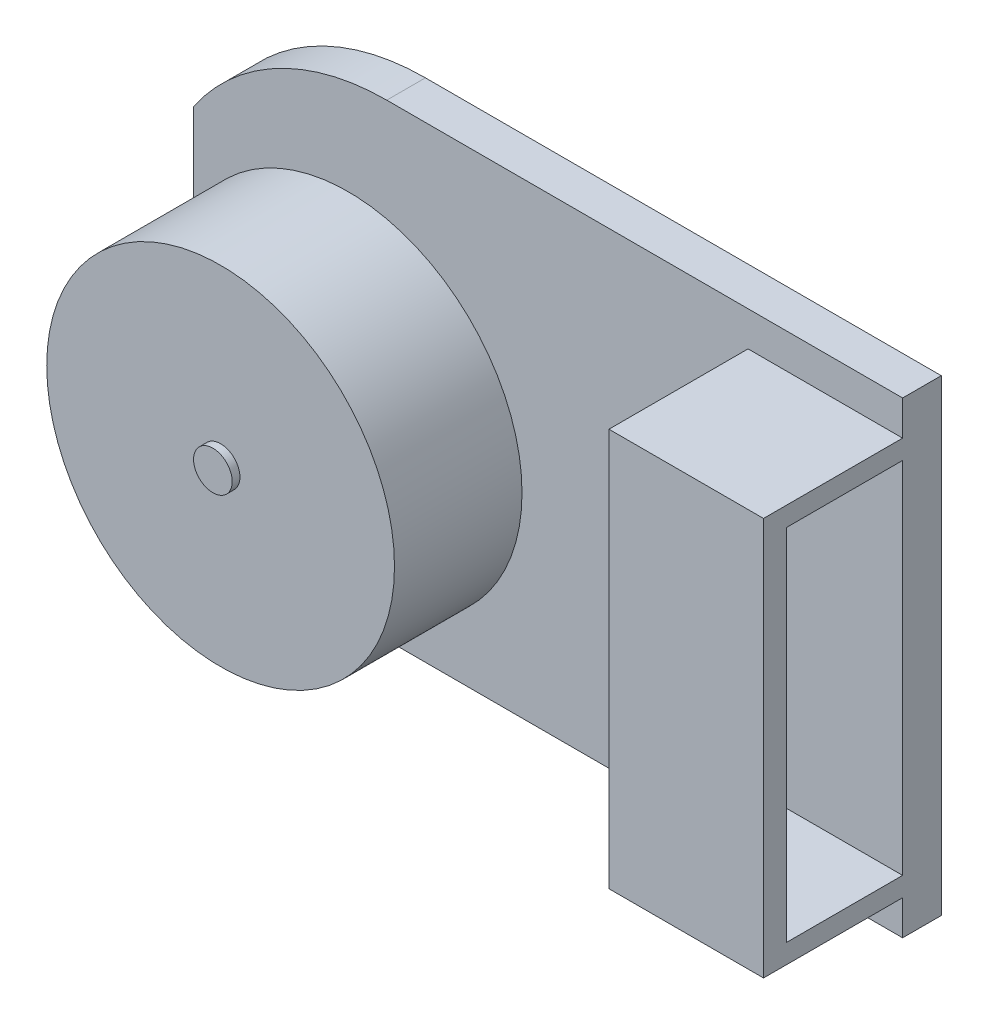
ISO-10303-21;
HEADER;
FILE_DESCRIPTION(('STEP AP214'),'2;1');
FILE_NAME('part.step','',(''),(''),'','','');
FILE_SCHEMA(('AUTOMOTIVE_DESIGN { 1 0 10303 214 1 1 1 1 }'));
ENDSEC;
DATA;
#1=APPLICATION_CONTEXT('core data for automotive mechanical design processes');
#2=APPLICATION_PROTOCOL_DEFINITION('international standard','automotive_design',2000,#1);
#3=PRODUCT_CONTEXT('',#1,'mechanical');
#4=PRODUCT('Part','Part','',(#3));
#5=PRODUCT_RELATED_PRODUCT_CATEGORY('part','',(#4));
#6=PRODUCT_DEFINITION_FORMATION('','',#4);
#7=PRODUCT_DEFINITION_CONTEXT('part definition',#1,'design');
#8=PRODUCT_DEFINITION('design','',#6,#7);
#9=PRODUCT_DEFINITION_SHAPE('','',#8);
#10=(LENGTH_UNIT() NAMED_UNIT(*) SI_UNIT(.MILLI.,.METRE.));
#11=(NAMED_UNIT(*) PLANE_ANGLE_UNIT() SI_UNIT($,.RADIAN.));
#12=(NAMED_UNIT(*) SI_UNIT($,.STERADIAN.) SOLID_ANGLE_UNIT());
#13=UNCERTAINTY_MEASURE_WITH_UNIT(LENGTH_MEASURE(1.E-05),#10,'distance_accuracy_value','');
#14=(GEOMETRIC_REPRESENTATION_CONTEXT(3) GLOBAL_UNCERTAINTY_ASSIGNED_CONTEXT((#13)) GLOBAL_UNIT_ASSIGNED_CONTEXT((#10,
#11,#12)) REPRESENTATION_CONTEXT('',''));
#15=CARTESIAN_POINT('',(0.,0.,0.));
#16=DIRECTION('',(0.,0.,1.));
#17=DIRECTION('',(1.,0.,0.));
#18=AXIS2_PLACEMENT_3D('',#15,#16,#17);
#19=CARTESIAN_POINT('',(0.,0.,1.));
#20=DIRECTION('',(0.,0.,1.));
#21=DIRECTION('',(1.,0.,0.));
#22=AXIS2_PLACEMENT_3D('',#19,#20,#21);
#23=PLANE('',#22);
#24=CARTESIAN_POINT('',(0.,0.,1.));
#25=DIRECTION('',(0.,0.,1.));
#26=DIRECTION('',(1.,0.,0.));
#27=AXIS2_PLACEMENT_3D('',#24,#25,#26);
#28=CIRCLE('',#27,0.5);
#29=CARTESIAN_POINT('',(0.5,0.,1.));
#30=VERTEX_POINT('',#29);
#31=EDGE_CURVE('E234',#30,#30,#28,.T.);
#32=ORIENTED_EDGE('',*,*,#31,.F.);
#33=EDGE_LOOP('',(#32));
#34=FACE_BOUND('',#33,.T.);
#35=DIRECTION('',(0.,-1.,0.));
#36=VECTOR('',#35,1.);
#37=CARTESIAN_POINT('',(9.35,5.15,1.));
#38=LINE('',#37,#36);
#39=CARTESIAN_POINT('',(9.35,5.15,1.));
#40=VERTEX_POINT('',#39);
#41=CARTESIAN_POINT('',(9.35000000000001,-5.15,1.));
#42=VERTEX_POINT('',#41);
#43=EDGE_CURVE('E195',#40,#42,#38,.T.);
#44=ORIENTED_EDGE('',*,*,#43,.F.);
#45=DIRECTION('',(-1.,0.,0.));
#46=VECTOR('',#45,1.);
#47=CARTESIAN_POINT('',(13.35,5.15,1.));
#48=LINE('',#47,#46);
#49=CARTESIAN_POINT('',(13.35,5.15,1.));
#50=VERTEX_POINT('',#49);
#51=EDGE_CURVE('E153',#50,#40,#48,.T.);
#52=ORIENTED_EDGE('',*,*,#51,.F.);
#53=DIRECTION('',(0.,-1.,0.));
#54=VECTOR('',#53,1.);
#55=CARTESIAN_POINT('',(13.35,0.,1.));
#56=LINE('',#55,#54);
#57=CARTESIAN_POINT('',(13.35,6.05,1.));
#58=VERTEX_POINT('',#57);
#59=EDGE_CURVE('E231',#58,#50,#56,.T.);
#60=ORIENTED_EDGE('',*,*,#59,.F.);
#61=DIRECTION('',(1.,0.,0.));
#62=VECTOR('',#61,1.);
#63=CARTESIAN_POINT('',(0.,6.05,1.));
#64=LINE('',#63,#62);
#65=CARTESIAN_POINT('',(0.,6.05,1.));
#66=VERTEX_POINT('',#65);
#67=EDGE_CURVE('E216',#66,#58,#64,.T.);
#68=ORIENTED_EDGE('',*,*,#67,.F.);
#69=CARTESIAN_POINT('',(0.,0.,1.));
#70=DIRECTION('',(0.,0.,1.));
#71=DIRECTION('',(1.,0.,0.));
#72=AXIS2_PLACEMENT_3D('',#69,#70,#71);
#73=CIRCLE('',#72,6.05);
#74=CARTESIAN_POINT('',(-5.,3.40624426605022,1.));
#75=VERTEX_POINT('',#74);
#76=EDGE_CURVE('E219',#66,#75,#73,.T.);
#77=ORIENTED_EDGE('',*,*,#76,.T.);
#78=DIRECTION('',(0.,1.,0.));
#79=VECTOR('',#78,1.);
#80=CARTESIAN_POINT('',(-5.,0.,1.));
#81=LINE('',#80,#79);
#82=CARTESIAN_POINT('',(-5.,-3.40624426605022,1.));
#83=VERTEX_POINT('',#82);
#84=EDGE_CURVE('E222',#83,#75,#81,.T.);
#85=ORIENTED_EDGE('',*,*,#84,.F.);
#86=CARTESIAN_POINT('',(0.,0.,1.));
#87=DIRECTION('',(0.,0.,1.));
#88=DIRECTION('',(1.,0.,0.));
#89=AXIS2_PLACEMENT_3D('',#86,#87,#88);
#90=CIRCLE('',#89,6.05);
#91=CARTESIAN_POINT('',(0.,-6.05,1.));
#92=VERTEX_POINT('',#91);
#93=EDGE_CURVE('E225',#83,#92,#90,.T.);
#94=ORIENTED_EDGE('',*,*,#93,.T.);
#95=DIRECTION('',(1.,0.,0.));
#96=VECTOR('',#95,1.);
#97=CARTESIAN_POINT('',(0.,-6.05,1.));
#98=LINE('',#97,#96);
#99=CARTESIAN_POINT('',(13.35,-6.05,1.));
#100=VERTEX_POINT('',#99);
#101=EDGE_CURVE('E227',#92,#100,#98,.T.);
#102=ORIENTED_EDGE('',*,*,#101,.T.);
#103=CARTESIAN_POINT('',(13.35,-5.15,1.));
#104=VERTEX_POINT('',#103);
#105=EDGE_CURVE('E230',#104,#100,#56,.T.);
#106=ORIENTED_EDGE('',*,*,#105,.F.);
#107=DIRECTION('',(1.,0.,0.));
#108=VECTOR('',#107,1.);
#109=CARTESIAN_POINT('',(13.35,-5.15,1.));
#110=LINE('',#109,#108);
#111=EDGE_CURVE('E187',#42,#104,#110,.T.);
#112=ORIENTED_EDGE('',*,*,#111,.F.);
#113=EDGE_LOOP('',(#44,#52,#60,#68,#77,#85,#94,#102,#106,#112));
#114=FACE_BOUND('',#113,.T.);
#115=ADVANCED_FACE('F40',(#34,#114),#23,.T.);
#116=CARTESIAN_POINT('',(0.,0.,5.5));
#117=DIRECTION('',(0.,0.,-1.));
#118=DIRECTION('',(-1.,0.,0.));
#119=AXIS2_PLACEMENT_3D('',#116,#117,#118);
#120=CYLINDRICAL_SURFACE('',#119,0.5);
#121=ORIENTED_EDGE('',*,*,#31,.T.);
#122=EDGE_LOOP('',(#121));
#123=FACE_BOUND('',#122,.T.);
#124=CARTESIAN_POINT('',(0.,0.,2.));
#125=DIRECTION('',(0.,0.,1.));
#126=DIRECTION('',(1.,0.,0.));
#127=AXIS2_PLACEMENT_3D('',#124,#125,#126);
#128=CIRCLE('',#127,0.5);
#129=CARTESIAN_POINT('',(0.5,0.,2.));
#130=VERTEX_POINT('',#129);
#131=EDGE_CURVE('E44',#130,#130,#128,.F.);
#132=ORIENTED_EDGE('',*,*,#131,.T.);
#133=EDGE_LOOP('',(#132));
#134=FACE_BOUND('',#133,.T.);
#135=ADVANCED_FACE('F318',(#123,#134),#120,.T.);
#136=CARTESIAN_POINT('',(0.,6.05,1.));
#137=DIRECTION('',(0.,1.,0.));
#138=DIRECTION('',(0.,0.,1.));
#139=AXIS2_PLACEMENT_3D('',#136,#137,#138);
#140=PLANE('',#139);
#141=DIRECTION('',(1.,0.,0.));
#142=VECTOR('',#141,1.);
#143=CARTESIAN_POINT('',(0.,6.05,0.));
#144=LINE('',#143,#142);
#145=CARTESIAN_POINT('',(0.,6.05,0.));
#146=VERTEX_POINT('',#145);
#147=CARTESIAN_POINT('',(13.35,6.05,0.));
#148=VERTEX_POINT('',#147);
#149=EDGE_CURVE('E215',#146,#148,#144,.T.);
#150=ORIENTED_EDGE('',*,*,#149,.F.);
#151=DIRECTION('',(0.,0.,-1.));
#152=VECTOR('',#151,1.);
#153=CARTESIAN_POINT('',(0.,6.05,1.));
#154=LINE('',#153,#152);
#155=EDGE_CURVE('E49',#66,#146,#154,.T.);
#156=ORIENTED_EDGE('',*,*,#155,.F.);
#157=ORIENTED_EDGE('',*,*,#67,.T.);
#158=DIRECTION('',(0.,0.,-1.));
#159=VECTOR('',#158,1.);
#160=CARTESIAN_POINT('',(13.35,6.05,1.));
#161=LINE('',#160,#159);
#162=EDGE_CURVE('E237',#58,#148,#161,.T.);
#163=ORIENTED_EDGE('',*,*,#162,.T.);
#164=EDGE_LOOP('',(#150,#156,#157,#163));
#165=FACE_BOUND('',#164,.T.);
#166=ADVANCED_FACE('F42',(#165),#140,.T.);
#167=CARTESIAN_POINT('',(0.,0.,1.));
#168=DIRECTION('',(0.,0.,-1.));
#169=DIRECTION('',(-1.,0.,0.));
#170=AXIS2_PLACEMENT_3D('',#167,#168,#169);
#171=CYLINDRICAL_SURFACE('',#170,6.05);
#172=CARTESIAN_POINT('',(0.,0.,0.));
#173=DIRECTION('',(0.,0.,1.));
#174=DIRECTION('',(1.,0.,0.));
#175=AXIS2_PLACEMENT_3D('',#172,#173,#174);
#176=CIRCLE('',#175,6.05);
#177=CARTESIAN_POINT('',(-5.,3.40624426605022,0.));
#178=VERTEX_POINT('',#177);
#179=EDGE_CURVE('E240',#146,#178,#176,.T.);
#180=ORIENTED_EDGE('',*,*,#179,.T.);
#181=DIRECTION('',(0.,0.,-1.));
#182=VECTOR('',#181,1.);
#183=CARTESIAN_POINT('',(-5.,3.40624426605022,1.));
#184=LINE('',#183,#182);
#185=EDGE_CURVE('E261',#75,#178,#184,.T.);
#186=ORIENTED_EDGE('',*,*,#185,.F.);
#187=ORIENTED_EDGE('',*,*,#76,.F.);
#188=ORIENTED_EDGE('',*,*,#155,.T.);
#189=EDGE_LOOP('',(#180,#186,#187,#188));
#190=FACE_BOUND('',#189,.T.);
#191=ADVANCED_FACE('F266',(#190),#171,.T.);
#192=CARTESIAN_POINT('',(-5.,0.,1.));
#193=DIRECTION('',(-1.,0.,0.));
#194=DIRECTION('',(0.,0.,1.));
#195=AXIS2_PLACEMENT_3D('',#192,#193,#194);
#196=PLANE('',#195);
#197=DIRECTION('',(0.,1.,0.));
#198=VECTOR('',#197,1.);
#199=CARTESIAN_POINT('',(-5.,0.,0.));
#200=LINE('',#199,#198);
#201=CARTESIAN_POINT('',(-5.,-3.40624426605022,0.));
#202=VERTEX_POINT('',#201);
#203=EDGE_CURVE('E243',#202,#178,#200,.T.);
#204=ORIENTED_EDGE('',*,*,#203,.F.);
#205=DIRECTION('',(0.,0.,-1.));
#206=VECTOR('',#205,1.);
#207=CARTESIAN_POINT('',(-5.,-3.40624426605022,1.));
#208=LINE('',#207,#206);
#209=EDGE_CURVE('E259',#83,#202,#208,.T.);
#210=ORIENTED_EDGE('',*,*,#209,.F.);
#211=ORIENTED_EDGE('',*,*,#84,.T.);
#212=ORIENTED_EDGE('',*,*,#185,.T.);
#213=EDGE_LOOP('',(#204,#210,#211,#212));
#214=FACE_BOUND('',#213,.T.);
#215=ADVANCED_FACE('F291',(#214),#196,.T.);
#216=CARTESIAN_POINT('',(0.,0.,1.));
#217=DIRECTION('',(0.,0.,-1.));
#218=DIRECTION('',(-1.,0.,0.));
#219=AXIS2_PLACEMENT_3D('',#216,#217,#218);
#220=CYLINDRICAL_SURFACE('',#219,6.05);
#221=CARTESIAN_POINT('',(0.,0.,0.));
#222=DIRECTION('',(0.,0.,1.));
#223=DIRECTION('',(1.,0.,0.));
#224=AXIS2_PLACEMENT_3D('',#221,#222,#223);
#225=CIRCLE('',#224,6.05);
#226=CARTESIAN_POINT('',(0.,-6.05,0.));
#227=VERTEX_POINT('',#226);
#228=EDGE_CURVE('E246',#202,#227,#225,.T.);
#229=ORIENTED_EDGE('',*,*,#228,.T.);
#230=DIRECTION('',(0.,0.,-1.));
#231=VECTOR('',#230,1.);
#232=CARTESIAN_POINT('',(0.,-6.05,1.));
#233=LINE('',#232,#231);
#234=EDGE_CURVE('E256',#92,#227,#233,.T.);
#235=ORIENTED_EDGE('',*,*,#234,.F.);
#236=ORIENTED_EDGE('',*,*,#93,.F.);
#237=ORIENTED_EDGE('',*,*,#209,.T.);
#238=EDGE_LOOP('',(#229,#235,#236,#237));
#239=FACE_BOUND('',#238,.T.);
#240=ADVANCED_FACE('F288',(#239),#220,.T.);
#241=CARTESIAN_POINT('',(0.,-6.05,1.));
#242=DIRECTION('',(0.,1.,0.));
#243=DIRECTION('',(0.,0.,1.));
#244=AXIS2_PLACEMENT_3D('',#241,#242,#243);
#245=PLANE('',#244);
#246=DIRECTION('',(1.,0.,0.));
#247=VECTOR('',#246,1.);
#248=CARTESIAN_POINT('',(0.,-6.05,0.));
#249=LINE('',#248,#247);
#250=CARTESIAN_POINT('',(13.35,-6.05,0.));
#251=VERTEX_POINT('',#250);
#252=EDGE_CURVE('E248',#227,#251,#249,.T.);
#253=ORIENTED_EDGE('',*,*,#252,.T.);
#254=DIRECTION('',(0.,0.,-1.));
#255=VECTOR('',#254,1.);
#256=CARTESIAN_POINT('',(13.35,-6.05,1.));
#257=LINE('',#256,#255);
#258=EDGE_CURVE('E254',#100,#251,#257,.T.);
#259=ORIENTED_EDGE('',*,*,#258,.F.);
#260=ORIENTED_EDGE('',*,*,#101,.F.);
#261=ORIENTED_EDGE('',*,*,#234,.T.);
#262=EDGE_LOOP('',(#253,#259,#260,#261));
#263=FACE_BOUND('',#262,.T.);
#264=ADVANCED_FACE('F283',(#263),#245,.F.);
#265=CARTESIAN_POINT('',(13.35,0.,1.));
#266=DIRECTION('',(1.,0.,0.));
#267=DIRECTION('',(0.,0.,-1.));
#268=AXIS2_PLACEMENT_3D('',#265,#266,#267);
#269=PLANE('',#268);
#270=DIRECTION('',(0.,-1.,0.));
#271=VECTOR('',#270,1.);
#272=CARTESIAN_POINT('',(13.35,0.,4.));
#273=LINE('',#272,#271);
#274=CARTESIAN_POINT('',(13.35,4.65,4.));
#275=VERTEX_POINT('',#274);
#276=CARTESIAN_POINT('',(13.35,-4.65,4.));
#277=VERTEX_POINT('',#276);
#278=EDGE_CURVE('E174',#275,#277,#273,.T.);
#279=ORIENTED_EDGE('',*,*,#278,.F.);
#280=DIRECTION('',(0.,0.,-1.));
#281=VECTOR('',#280,1.);
#282=CARTESIAN_POINT('',(13.35,4.65,4.));
#283=LINE('',#282,#281);
#284=CARTESIAN_POINT('',(13.35,4.65,1.));
#285=VERTEX_POINT('',#284);
#286=EDGE_CURVE('E167',#275,#285,#283,.T.);
#287=ORIENTED_EDGE('',*,*,#286,.T.);
#288=DIRECTION('',(0.,-1.,0.));
#289=VECTOR('',#288,1.);
#290=CARTESIAN_POINT('',(13.35,0.,1.));
#291=LINE('',#290,#289);
#292=CARTESIAN_POINT('',(13.35,-4.65,1.));
#293=VERTEX_POINT('',#292);
#294=EDGE_CURVE('E168',#285,#293,#291,.T.);
#295=ORIENTED_EDGE('',*,*,#294,.T.);
#296=DIRECTION('',(0.,0.,-1.));
#297=VECTOR('',#296,1.);
#298=CARTESIAN_POINT('',(13.35,-4.65,4.));
#299=LINE('',#298,#297);
#300=EDGE_CURVE('E181',#277,#293,#299,.T.);
#301=ORIENTED_EDGE('',*,*,#300,.F.);
#302=EDGE_LOOP('',(#279,#287,#295,#301));
#303=FACE_BOUND('',#302,.T.);
#304=DIRECTION('',(0.,-1.,0.));
#305=VECTOR('',#304,1.);
#306=CARTESIAN_POINT('',(13.35,0.,0.));
#307=LINE('',#306,#305);
#308=EDGE_CURVE('E220',#148,#251,#307,.T.);
#309=ORIENTED_EDGE('',*,*,#308,.F.);
#310=ORIENTED_EDGE('',*,*,#162,.F.);
#311=ORIENTED_EDGE('',*,*,#59,.T.);
#312=DIRECTION('',(0.,0.,-1.));
#313=VECTOR('',#312,1.);
#314=CARTESIAN_POINT('',(13.35,5.15,4.6));
#315=LINE('',#314,#313);
#316=CARTESIAN_POINT('',(13.35,5.15,4.6));
#317=VERTEX_POINT('',#316);
#318=EDGE_CURVE('E204',#317,#50,#315,.T.);
#319=ORIENTED_EDGE('',*,*,#318,.F.);
#320=DIRECTION('',(0.,1.,0.));
#321=VECTOR('',#320,1.);
#322=CARTESIAN_POINT('',(13.35,0.,4.6));
#323=LINE('',#322,#321);
#324=CARTESIAN_POINT('',(13.35,-5.15,4.6));
#325=VERTEX_POINT('',#324);
#326=EDGE_CURVE('E184',#325,#317,#323,.T.);
#327=ORIENTED_EDGE('',*,*,#326,.F.);
#328=DIRECTION('',(0.,0.,-1.));
#329=VECTOR('',#328,1.);
#330=CARTESIAN_POINT('',(13.35,-5.15,4.6));
#331=LINE('',#330,#329);
#332=EDGE_CURVE('E193',#325,#104,#331,.T.);
#333=ORIENTED_EDGE('',*,*,#332,.T.);
#334=ORIENTED_EDGE('',*,*,#105,.T.);
#335=ORIENTED_EDGE('',*,*,#258,.T.);
#336=EDGE_LOOP('',(#309,#310,#311,#319,#327,#333,#334,#335));
#337=FACE_BOUND('',#336,.T.);
#338=ADVANCED_FACE('F278',(#303,#337),#269,.T.);
#339=CARTESIAN_POINT('',(0.,0.,0.));
#340=DIRECTION('',(0.,0.,1.));
#341=DIRECTION('',(1.,0.,0.));
#342=AXIS2_PLACEMENT_3D('',#339,#340,#341);
#343=PLANE('',#342);
#344=ORIENTED_EDGE('',*,*,#149,.T.);
#345=ORIENTED_EDGE('',*,*,#308,.T.);
#346=ORIENTED_EDGE('',*,*,#252,.F.);
#347=ORIENTED_EDGE('',*,*,#228,.F.);
#348=ORIENTED_EDGE('',*,*,#203,.T.);
#349=ORIENTED_EDGE('',*,*,#179,.F.);
#350=EDGE_LOOP('',(#344,#345,#346,#347,#348,#349));
#351=FACE_BOUND('',#350,.T.);
#352=ADVANCED_FACE('F272',(#351),#343,.F.);
#353=CARTESIAN_POINT('',(0.,0.,18.0279220613579));
#354=DIRECTION('',(0.,0.,-1.));
#355=DIRECTION('',(-1.,0.,0.));
#356=AXIS2_PLACEMENT_3D('',#353,#354,#355);
#357=CYLINDRICAL_SURFACE('',#356,4.5);
#358=CARTESIAN_POINT('',(0.,0.,2.));
#359=DIRECTION('',(0.,0.,1.));
#360=DIRECTION('',(1.,0.,0.));
#361=AXIS2_PLACEMENT_3D('',#358,#359,#360);
#362=CIRCLE('',#361,4.5);
#363=CARTESIAN_POINT('',(4.5,0.,2.));
#364=VERTEX_POINT('',#363);
#365=EDGE_CURVE('E206',#364,#364,#362,.T.);
#366=ORIENTED_EDGE('',*,*,#365,.T.);
#367=EDGE_LOOP('',(#366));
#368=FACE_BOUND('',#367,.T.);
#369=CARTESIAN_POINT('',(0.,0.,5.3));
#370=DIRECTION('',(0.,0.,1.));
#371=DIRECTION('',(1.,0.,0.));
#372=AXIS2_PLACEMENT_3D('',#369,#370,#371);
#373=CIRCLE('',#372,4.5);
#374=CARTESIAN_POINT('',(4.5,0.,5.3));
#375=VERTEX_POINT('',#374);
#376=EDGE_CURVE('E209',#375,#375,#373,.T.);
#377=ORIENTED_EDGE('',*,*,#376,.F.);
#378=EDGE_LOOP('',(#377));
#379=FACE_BOUND('',#378,.T.);
#380=ADVANCED_FACE('F332',(#368,#379),#357,.T.);
#381=CARTESIAN_POINT('',(0.,0.,2.));
#382=DIRECTION('',(0.,0.,1.));
#383=DIRECTION('',(1.,0.,0.));
#384=AXIS2_PLACEMENT_3D('',#381,#382,#383);
#385=PLANE('',#384);
#386=ORIENTED_EDGE('',*,*,#131,.F.);
#387=EDGE_LOOP('',(#386));
#388=FACE_BOUND('',#387,.T.);
#389=ORIENTED_EDGE('',*,*,#365,.F.);
#390=EDGE_LOOP('',(#389));
#391=FACE_BOUND('',#390,.T.);
#392=ADVANCED_FACE('F391',(#388,#391),#385,.F.);
#393=CARTESIAN_POINT('',(0.,0.,5.3));
#394=DIRECTION('',(0.,0.,1.));
#395=DIRECTION('',(1.,0.,0.));
#396=AXIS2_PLACEMENT_3D('',#393,#394,#395);
#397=PLANE('',#396);
#398=CARTESIAN_POINT('',(0.,0.,5.3));
#399=DIRECTION('',(0.,0.,1.));
#400=DIRECTION('',(1.,0.,0.));
#401=AXIS2_PLACEMENT_3D('',#398,#399,#400);
#402=CIRCLE('',#401,0.5);
#403=CARTESIAN_POINT('',(0.5,0.,5.3));
#404=VERTEX_POINT('',#403);
#405=EDGE_CURVE('E11',#404,#404,#402,.F.);
#406=ORIENTED_EDGE('',*,*,#405,.T.);
#407=EDGE_LOOP('',(#406));
#408=FACE_BOUND('',#407,.T.);
#409=ORIENTED_EDGE('',*,*,#376,.T.);
#410=EDGE_LOOP('',(#409));
#411=FACE_BOUND('',#410,.T.);
#412=ADVANCED_FACE('F373',(#408,#411),#397,.T.);
#413=CARTESIAN_POINT('',(0.,0.,5.5));
#414=DIRECTION('',(0.,0.,-1.));
#415=DIRECTION('',(-1.,0.,0.));
#416=AXIS2_PLACEMENT_3D('',#413,#414,#415);
#417=PLANE('',#416);
#418=CARTESIAN_POINT('',(0.,0.,5.5));
#419=DIRECTION('',(0.,0.,-1.));
#420=DIRECTION('',(-1.,0.,0.));
#421=AXIS2_PLACEMENT_3D('',#418,#419,#420);
#422=CIRCLE('',#421,0.5);
#423=CARTESIAN_POINT('',(-0.5,0.,5.5));
#424=VERTEX_POINT('',#423);
#425=EDGE_CURVE('E212',#424,#424,#422,.T.);
#426=ORIENTED_EDGE('',*,*,#425,.F.);
#427=EDGE_LOOP('',(#426));
#428=FACE_BOUND('',#427,.T.);
#429=ADVANCED_FACE('F363',(#428),#417,.F.);
#430=ORIENTED_EDGE('',*,*,#405,.F.);
#431=EDGE_LOOP('',(#430));
#432=FACE_BOUND('',#431,.T.);
#433=ORIENTED_EDGE('',*,*,#425,.T.);
#434=EDGE_LOOP('',(#433));
#435=FACE_BOUND('',#434,.T.);
#436=ADVANCED_FACE('F326',(#432,#435),#120,.T.);
#437=CARTESIAN_POINT('',(13.35,5.15,4.6));
#438=DIRECTION('',(0.,-1.,0.));
#439=DIRECTION('',(1.,0.,0.));
#440=AXIS2_PLACEMENT_3D('',#437,#438,#439);
#441=PLANE('',#440);
#442=ORIENTED_EDGE('',*,*,#51,.T.);
#443=DIRECTION('',(0.,0.,-1.));
#444=VECTOR('',#443,1.);
#445=CARTESIAN_POINT('',(9.35,5.15,4.6));
#446=LINE('',#445,#444);
#447=CARTESIAN_POINT('',(9.35,5.15,4.6));
#448=VERTEX_POINT('',#447);
#449=EDGE_CURVE('E201',#448,#40,#446,.T.);
#450=ORIENTED_EDGE('',*,*,#449,.F.);
#451=DIRECTION('',(-1.,0.,0.));
#452=VECTOR('',#451,1.);
#453=CARTESIAN_POINT('',(13.35,5.15,4.6));
#454=LINE('',#453,#452);
#455=EDGE_CURVE('E186',#317,#448,#454,.T.);
#456=ORIENTED_EDGE('',*,*,#455,.F.);
#457=ORIENTED_EDGE('',*,*,#318,.T.);
#458=EDGE_LOOP('',(#442,#450,#456,#457));
#459=FACE_BOUND('',#458,.T.);
#460=ADVANCED_FACE('F298',(#459),#441,.F.);
#461=CARTESIAN_POINT('',(9.35,5.15,4.6));
#462=DIRECTION('',(1.,0.,0.));
#463=DIRECTION('',(0.,1.,0.));
#464=AXIS2_PLACEMENT_3D('',#461,#462,#463);
#465=PLANE('',#464);
#466=ORIENTED_EDGE('',*,*,#43,.T.);
#467=DIRECTION('',(0.,0.,-1.));
#468=VECTOR('',#467,1.);
#469=CARTESIAN_POINT('',(9.35000000000001,-5.15,4.6));
#470=LINE('',#469,#468);
#471=CARTESIAN_POINT('',(9.35000000000001,-5.15,4.6));
#472=VERTEX_POINT('',#471);
#473=EDGE_CURVE('E64',#472,#42,#470,.T.);
#474=ORIENTED_EDGE('',*,*,#473,.F.);
#475=DIRECTION('',(0.,-1.,0.));
#476=VECTOR('',#475,1.);
#477=CARTESIAN_POINT('',(9.35,5.15,4.6));
#478=LINE('',#477,#476);
#479=EDGE_CURVE('E189',#448,#472,#478,.T.);
#480=ORIENTED_EDGE('',*,*,#479,.F.);
#481=ORIENTED_EDGE('',*,*,#449,.T.);
#482=EDGE_LOOP('',(#466,#474,#480,#481));
#483=FACE_BOUND('',#482,.T.);
#484=ADVANCED_FACE('F302',(#483),#465,.F.);
#485=CARTESIAN_POINT('',(13.35,-5.15,4.6));
#486=DIRECTION('',(0.,1.,0.));
#487=DIRECTION('',(-1.,0.,0.));
#488=AXIS2_PLACEMENT_3D('',#485,#486,#487);
#489=PLANE('',#488);
#490=ORIENTED_EDGE('',*,*,#111,.T.);
#491=ORIENTED_EDGE('',*,*,#332,.F.);
#492=DIRECTION('',(1.,0.,0.));
#493=VECTOR('',#492,1.);
#494=CARTESIAN_POINT('',(13.35,-5.15,4.6));
#495=LINE('',#494,#493);
#496=EDGE_CURVE('E191',#472,#325,#495,.T.);
#497=ORIENTED_EDGE('',*,*,#496,.F.);
#498=ORIENTED_EDGE('',*,*,#473,.T.);
#499=EDGE_LOOP('',(#490,#491,#497,#498));
#500=FACE_BOUND('',#499,.T.);
#501=ADVANCED_FACE('F308',(#500),#489,.F.);
#502=CARTESIAN_POINT('',(0.,0.,4.6));
#503=DIRECTION('',(0.,0.,-1.));
#504=DIRECTION('',(-1.,0.,0.));
#505=AXIS2_PLACEMENT_3D('',#502,#503,#504);
#506=PLANE('',#505);
#507=ORIENTED_EDGE('',*,*,#326,.T.);
#508=ORIENTED_EDGE('',*,*,#455,.T.);
#509=ORIENTED_EDGE('',*,*,#479,.T.);
#510=ORIENTED_EDGE('',*,*,#496,.T.);
#511=EDGE_LOOP('',(#507,#508,#509,#510));
#512=FACE_BOUND('',#511,.T.);
#513=ADVANCED_FACE('F304',(#512),#506,.F.);
#514=CARTESIAN_POINT('',(0.,4.65,4.));
#515=DIRECTION('',(0.,1.,0.));
#516=DIRECTION('',(0.,0.,1.));
#517=AXIS2_PLACEMENT_3D('',#514,#515,#516);
#518=PLANE('',#517);
#519=DIRECTION('',(1.,0.,0.));
#520=VECTOR('',#519,1.);
#521=CARTESIAN_POINT('',(0.,4.65,1.));
#522=LINE('',#521,#520);
#523=CARTESIAN_POINT('',(9.85,4.65,1.));
#524=VERTEX_POINT('',#523);
#525=EDGE_CURVE('E176',#524,#285,#522,.T.);
#526=ORIENTED_EDGE('',*,*,#525,.T.);
#527=ORIENTED_EDGE('',*,*,#286,.F.);
#528=DIRECTION('',(1.,0.,0.));
#529=VECTOR('',#528,1.);
#530=CARTESIAN_POINT('',(0.,4.65,4.));
#531=LINE('',#530,#529);
#532=CARTESIAN_POINT('',(9.85,4.65,4.));
#533=VERTEX_POINT('',#532);
#534=EDGE_CURVE('E161',#533,#275,#531,.T.);
#535=ORIENTED_EDGE('',*,*,#534,.F.);
#536=DIRECTION('',(0.,0.,-1.));
#537=VECTOR('',#536,1.);
#538=CARTESIAN_POINT('',(9.85,4.65,4.));
#539=LINE('',#538,#537);
#540=EDGE_CURVE('E143',#533,#524,#539,.T.);
#541=ORIENTED_EDGE('',*,*,#540,.T.);
#542=EDGE_LOOP('',(#526,#527,#535,#541));
#543=FACE_BOUND('',#542,.T.);
#544=ADVANCED_FACE('F165',(#543),#518,.F.);
#545=CARTESIAN_POINT('',(9.85,0.,4.));
#546=DIRECTION('',(1.,0.,0.));
#547=DIRECTION('',(0.,1.,0.));
#548=AXIS2_PLACEMENT_3D('',#545,#546,#547);
#549=PLANE('',#548);
#550=DIRECTION('',(0.,-1.,0.));
#551=VECTOR('',#550,1.);
#552=CARTESIAN_POINT('',(9.85,0.,1.));
#553=LINE('',#552,#551);
#554=CARTESIAN_POINT('',(9.85000000000001,-4.65,1.));
#555=VERTEX_POINT('',#554);
#556=EDGE_CURVE('E149',#524,#555,#553,.T.);
#557=ORIENTED_EDGE('',*,*,#556,.F.);
#558=ORIENTED_EDGE('',*,*,#540,.F.);
#559=DIRECTION('',(0.,-1.,0.));
#560=VECTOR('',#559,1.);
#561=CARTESIAN_POINT('',(9.85,0.,4.));
#562=LINE('',#561,#560);
#563=CARTESIAN_POINT('',(9.85000000000001,-4.65,4.));
#564=VERTEX_POINT('',#563);
#565=EDGE_CURVE('E147',#533,#564,#562,.T.);
#566=ORIENTED_EDGE('',*,*,#565,.T.);
#567=DIRECTION('',(0.,0.,-1.));
#568=VECTOR('',#567,1.);
#569=CARTESIAN_POINT('',(9.85000000000001,-4.65,4.));
#570=LINE('',#569,#568);
#571=EDGE_CURVE('E154',#564,#555,#570,.T.);
#572=ORIENTED_EDGE('',*,*,#571,.T.);
#573=EDGE_LOOP('',(#557,#558,#566,#572));
#574=FACE_BOUND('',#573,.T.);
#575=ADVANCED_FACE('F145',(#574),#549,.T.);
#576=CARTESIAN_POINT('',(0.,-4.65,4.));
#577=DIRECTION('',(0.,1.,0.));
#578=DIRECTION('',(0.,0.,1.));
#579=AXIS2_PLACEMENT_3D('',#576,#577,#578);
#580=PLANE('',#579);
#581=DIRECTION('',(1.,0.,0.));
#582=VECTOR('',#581,1.);
#583=CARTESIAN_POINT('',(0.,-4.65,1.));
#584=LINE('',#583,#582);
#585=EDGE_CURVE('E56',#555,#293,#584,.T.);
#586=ORIENTED_EDGE('',*,*,#585,.F.);
#587=ORIENTED_EDGE('',*,*,#571,.F.);
#588=DIRECTION('',(1.,0.,0.));
#589=VECTOR('',#588,1.);
#590=CARTESIAN_POINT('',(0.,-4.65,4.));
#591=LINE('',#590,#589);
#592=EDGE_CURVE('E163',#564,#277,#591,.T.);
#593=ORIENTED_EDGE('',*,*,#592,.T.);
#594=ORIENTED_EDGE('',*,*,#300,.T.);
#595=EDGE_LOOP('',(#586,#587,#593,#594));
#596=FACE_BOUND('',#595,.T.);
#597=ADVANCED_FACE('F504',(#596),#580,.T.);
#598=CARTESIAN_POINT('',(0.,0.,4.));
#599=DIRECTION('',(0.,0.,1.));
#600=DIRECTION('',(1.,0.,0.));
#601=AXIS2_PLACEMENT_3D('',#598,#599,#600);
#602=PLANE('',#601);
#603=ORIENTED_EDGE('',*,*,#534,.T.);
#604=ORIENTED_EDGE('',*,*,#278,.T.);
#605=ORIENTED_EDGE('',*,*,#592,.F.);
#606=ORIENTED_EDGE('',*,*,#565,.F.);
#607=EDGE_LOOP('',(#603,#604,#605,#606));
#608=FACE_BOUND('',#607,.T.);
#609=ADVANCED_FACE('F159',(#608),#602,.F.);
#610=CARTESIAN_POINT('',(0.,0.,1.));
#611=DIRECTION('',(0.,0.,1.));
#612=DIRECTION('',(1.,0.,0.));
#613=AXIS2_PLACEMENT_3D('',#610,#611,#612);
#614=PLANE('',#613);
#615=ORIENTED_EDGE('',*,*,#525,.F.);
#616=ORIENTED_EDGE('',*,*,#556,.T.);
#617=ORIENTED_EDGE('',*,*,#585,.T.);
#618=ORIENTED_EDGE('',*,*,#294,.F.);
#619=EDGE_LOOP('',(#615,#616,#617,#618));
#620=FACE_BOUND('',#619,.T.);
#621=ADVANCED_FACE('F550',(#620),#614,.T.);
#622=CLOSED_SHELL('',(#115,#135,#166,#191,#215,#240,#264,#338,#352,#380,#392,#412,#429,#436,
#460,#484,#501,#513,#544,#575,#597,#609,#621));
#623=MANIFOLD_SOLID_BREP('B2',#622);
#624=ADVANCED_BREP_SHAPE_REPRESENTATION('',(#18,#623),#14);
#625=SHAPE_DEFINITION_REPRESENTATION(#9,#624);
ENDSEC;
END-ISO-10303-21;
